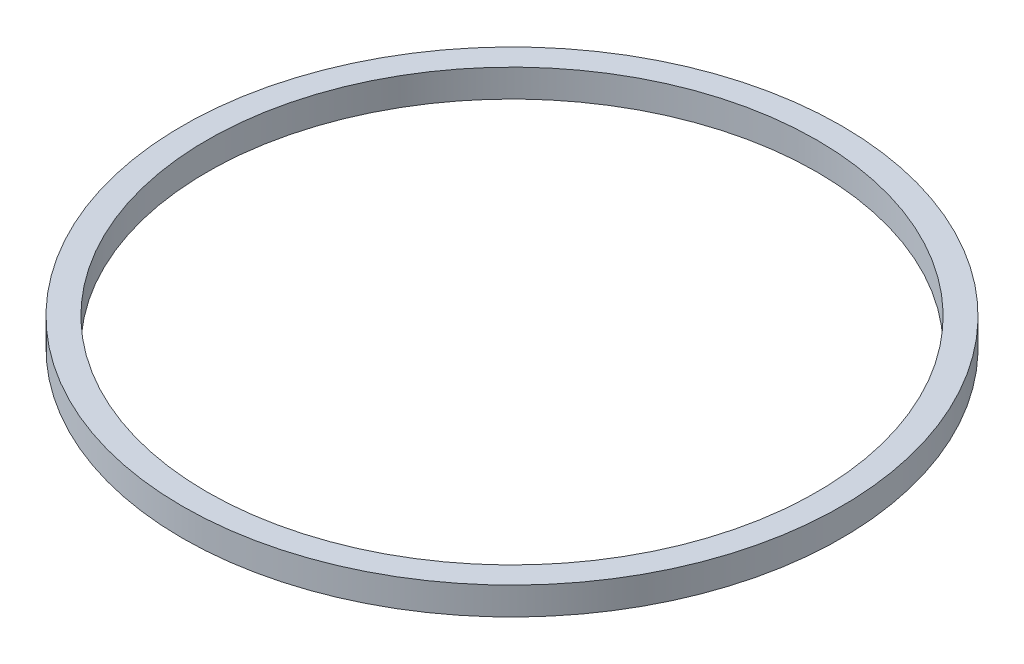
ISO-10303-21;
HEADER;
FILE_DESCRIPTION(('STEP AP214'),'2;1');
FILE_NAME('part.step','',(''),(''),'','','');
FILE_SCHEMA(('AUTOMOTIVE_DESIGN { 1 0 10303 214 1 1 1 1 }'));
ENDSEC;
DATA;
#1=APPLICATION_CONTEXT('core data for automotive mechanical design processes');
#2=APPLICATION_PROTOCOL_DEFINITION('international standard','automotive_design',2000,#1);
#3=PRODUCT_CONTEXT('',#1,'mechanical');
#4=PRODUCT('Part','Part','',(#3));
#5=PRODUCT_RELATED_PRODUCT_CATEGORY('part','',(#4));
#6=PRODUCT_DEFINITION_FORMATION('','',#4);
#7=PRODUCT_DEFINITION_CONTEXT('part definition',#1,'design');
#8=PRODUCT_DEFINITION('design','',#6,#7);
#9=PRODUCT_DEFINITION_SHAPE('','',#8);
#10=(LENGTH_UNIT() NAMED_UNIT(*) SI_UNIT(.MILLI.,.METRE.));
#11=(NAMED_UNIT(*) PLANE_ANGLE_UNIT() SI_UNIT($,.RADIAN.));
#12=(NAMED_UNIT(*) SI_UNIT($,.STERADIAN.) SOLID_ANGLE_UNIT());
#13=UNCERTAINTY_MEASURE_WITH_UNIT(LENGTH_MEASURE(1.E-05),#10,'distance_accuracy_value','');
#14=(GEOMETRIC_REPRESENTATION_CONTEXT(3) GLOBAL_UNCERTAINTY_ASSIGNED_CONTEXT((#13)) GLOBAL_UNIT_ASSIGNED_CONTEXT((#10,
#11,#12)) REPRESENTATION_CONTEXT('',''));
#15=CARTESIAN_POINT('',(0.,0.,0.));
#16=DIRECTION('',(0.,0.,1.));
#17=DIRECTION('',(1.,0.,0.));
#18=AXIS2_PLACEMENT_3D('',#15,#16,#17);
#19=CARTESIAN_POINT('',(0.,19.05,0.));
#20=DIRECTION('',(0.,1.,0.));
#21=DIRECTION('',(0.,0.,1.));
#22=AXIS2_PLACEMENT_3D('',#19,#20,#21);
#23=PLANE('',#22);
#24=CARTESIAN_POINT('',(0.,19.05,0.));
#25=DIRECTION('',(0.,1.,0.));
#26=DIRECTION('',(0.,0.,1.));
#27=AXIS2_PLACEMENT_3D('',#24,#25,#26);
#28=CIRCLE('',#27,227.);
#29=CARTESIAN_POINT('',(0.,19.05,-227.));
#30=VERTEX_POINT('',#29);
#31=EDGE_CURVE('E10',#30,#30,#28,.T.);
#32=ORIENTED_EDGE('',*,*,#31,.T.);
#33=EDGE_LOOP('',(#32));
#34=FACE_BOUND('',#33,.T.);
#35=CARTESIAN_POINT('',(0.,19.05,0.));
#36=DIRECTION('',(0.,1.,0.));
#37=DIRECTION('',(0.,0.,1.));
#38=AXIS2_PLACEMENT_3D('',#35,#36,#37);
#39=CIRCLE('',#38,210.);
#40=CARTESIAN_POINT('',(0.,19.05,-210.));
#41=VERTEX_POINT('',#40);
#42=EDGE_CURVE('E46',#41,#41,#39,.T.);
#43=ORIENTED_EDGE('',*,*,#42,.F.);
#44=EDGE_LOOP('',(#43));
#45=FACE_BOUND('',#44,.T.);
#46=ADVANCED_FACE('F35',(#34,#45),#23,.T.);
#47=CARTESIAN_POINT('',(0.,0.,0.));
#48=DIRECTION('',(0.,1.,0.));
#49=DIRECTION('',(0.,0.,1.));
#50=AXIS2_PLACEMENT_3D('',#47,#48,#49);
#51=PLANE('',#50);
#52=CARTESIAN_POINT('',(0.,0.,0.));
#53=DIRECTION('',(0.,1.,0.));
#54=DIRECTION('',(0.,0.,1.));
#55=AXIS2_PLACEMENT_3D('',#52,#53,#54);
#56=CIRCLE('',#55,227.);
#57=CARTESIAN_POINT('',(0.,0.,-227.));
#58=VERTEX_POINT('',#57);
#59=EDGE_CURVE('E39',#58,#58,#56,.T.);
#60=ORIENTED_EDGE('',*,*,#59,.F.);
#61=EDGE_LOOP('',(#60));
#62=FACE_BOUND('',#61,.T.);
#63=CARTESIAN_POINT('',(0.,0.,0.));
#64=DIRECTION('',(0.,1.,0.));
#65=DIRECTION('',(0.,0.,1.));
#66=AXIS2_PLACEMENT_3D('',#63,#64,#65);
#67=CIRCLE('',#66,210.);
#68=CARTESIAN_POINT('',(0.,0.,-210.));
#69=VERTEX_POINT('',#68);
#70=EDGE_CURVE('E48',#69,#69,#67,.T.);
#71=ORIENTED_EDGE('',*,*,#70,.T.);
#72=EDGE_LOOP('',(#71));
#73=FACE_BOUND('',#72,.T.);
#74=ADVANCED_FACE('F58',(#62,#73),#51,.F.);
#75=CARTESIAN_POINT('',(0.,19.05,0.));
#76=DIRECTION('',(0.,-1.,0.));
#77=DIRECTION('',(0.,0.,-1.));
#78=AXIS2_PLACEMENT_3D('',#75,#76,#77);
#79=CYLINDRICAL_SURFACE('',#78,227.);
#80=CARTESIAN_POINT('',(0.,19.05,-227.));
#81=CARTESIAN_POINT('',(0.,18.8515625,-227.));
#82=CARTESIAN_POINT('',(0.,18.653125,-227.));
#83=CARTESIAN_POINT('',(0.,18.25625,-227.));
#84=CARTESIAN_POINT('',(0.,18.0578125,-227.));
#85=CARTESIAN_POINT('',(0.,17.6609375,-227.));
#86=CARTESIAN_POINT('',(0.,17.4625,-227.));
#87=CARTESIAN_POINT('',(0.,17.065625,-227.));
#88=CARTESIAN_POINT('',(0.,16.8671875,-227.));
#89=CARTESIAN_POINT('',(0.,16.4703125,-227.));
#90=CARTESIAN_POINT('',(0.,16.271875,-227.));
#91=CARTESIAN_POINT('',(0.,15.875,-227.));
#92=CARTESIAN_POINT('',(0.,15.6765625,-227.));
#93=CARTESIAN_POINT('',(0.,15.2796875,-227.));
#94=CARTESIAN_POINT('',(0.,15.08125,-227.));
#95=CARTESIAN_POINT('',(0.,14.684375,-227.));
#96=CARTESIAN_POINT('',(0.,14.4859375,-227.));
#97=CARTESIAN_POINT('',(0.,14.0890625,-227.));
#98=CARTESIAN_POINT('',(0.,13.890625,-227.));
#99=CARTESIAN_POINT('',(0.,13.49375,-227.));
#100=CARTESIAN_POINT('',(0.,13.2953125,-227.));
#101=CARTESIAN_POINT('',(0.,12.8984375,-227.));
#102=CARTESIAN_POINT('',(0.,12.7,-227.));
#103=CARTESIAN_POINT('',(0.,12.303125,-227.));
#104=CARTESIAN_POINT('',(0.,12.1046875,-227.));
#105=CARTESIAN_POINT('',(0.,11.7078125,-227.));
#106=CARTESIAN_POINT('',(0.,11.509375,-227.));
#107=CARTESIAN_POINT('',(0.,11.1125,-227.));
#108=CARTESIAN_POINT('',(0.,10.9140625,-227.));
#109=CARTESIAN_POINT('',(0.,10.5171875,-227.));
#110=CARTESIAN_POINT('',(0.,10.31875,-227.));
#111=CARTESIAN_POINT('',(0.,9.921875,-227.));
#112=CARTESIAN_POINT('',(0.,9.7234375,-227.));
#113=CARTESIAN_POINT('',(0.,9.3265625,-227.));
#114=CARTESIAN_POINT('',(0.,9.128125,-227.));
#115=CARTESIAN_POINT('',(0.,8.73125,-227.));
#116=CARTESIAN_POINT('',(0.,8.5328125,-227.));
#117=CARTESIAN_POINT('',(0.,8.1359375,-227.));
#118=CARTESIAN_POINT('',(0.,7.9375,-227.));
#119=CARTESIAN_POINT('',(0.,7.540625,-227.));
#120=CARTESIAN_POINT('',(0.,7.3421875,-227.));
#121=CARTESIAN_POINT('',(0.,6.9453125,-227.));
#122=CARTESIAN_POINT('',(0.,6.746875,-227.));
#123=CARTESIAN_POINT('',(0.,6.35,-227.));
#124=CARTESIAN_POINT('',(0.,6.1515625,-227.));
#125=CARTESIAN_POINT('',(0.,5.7546875,-227.));
#126=CARTESIAN_POINT('',(0.,5.55625,-227.));
#127=CARTESIAN_POINT('',(0.,5.159375,-227.));
#128=CARTESIAN_POINT('',(0.,4.9609375,-227.));
#129=CARTESIAN_POINT('',(0.,4.5640625,-227.));
#130=CARTESIAN_POINT('',(0.,4.365625,-227.));
#131=CARTESIAN_POINT('',(0.,3.96875,-227.));
#132=CARTESIAN_POINT('',(0.,3.7703125,-227.));
#133=CARTESIAN_POINT('',(0.,3.3734375,-227.));
#134=CARTESIAN_POINT('',(0.,3.175,-227.));
#135=CARTESIAN_POINT('',(0.,2.778125,-227.));
#136=CARTESIAN_POINT('',(0.,2.5796875,-227.));
#137=CARTESIAN_POINT('',(0.,2.1828125,-227.));
#138=CARTESIAN_POINT('',(0.,1.984375,-227.));
#139=CARTESIAN_POINT('',(0.,1.5875,-227.));
#140=CARTESIAN_POINT('',(0.,1.3890625,-227.));
#141=CARTESIAN_POINT('',(0.,0.992187500000001,-227.));
#142=CARTESIAN_POINT('',(0.,0.793750000000001,-227.));
#143=CARTESIAN_POINT('',(0.,0.396875,-227.));
#144=CARTESIAN_POINT('',(0.,0.1984375,-227.));
#145=CARTESIAN_POINT('',(0.,0.,-227.));
#146=B_SPLINE_CURVE_WITH_KNOTS('',3,(#80,#81,#82,#83,#84,#85,#86,#87,#88,#89,#90,#91,#92,#93,
#94,#95,#96,#97,#98,#99,#100,#101,#102,#103,#104,#105,#106,#107,#108,#109,#110,#111,#112,#113,
#114,#115,#116,#117,#118,#119,#120,#121,#122,#123,#124,#125,#126,#127,#128,#129,#130,#131,#132,
#133,#134,#135,#136,#137,#138,#139,#140,#141,#142,#143,#144,#145),.UNSPECIFIED.,.F.,.F.,(4,2,2,
2,2,2,2,2,2,2,2,2,2,2,2,2,2,2,2,2,2,2,2,2,2,2,2,2,2,2,2,2,4),(0.,0.595312499999997,1.190625,
1.7859375,2.38125,2.9765625,3.571875,4.1671875,4.7625,5.3578125,5.953125,6.5484375,7.14375,
7.7390625,8.334375,8.9296875,9.525,10.1203125,10.715625,11.3109375,11.90625,12.5015625,
13.096875,13.6921875,14.2875,14.8828125,15.478125,16.0734375,16.66875,17.2640625,17.859375,
18.4546875,19.05),.UNSPECIFIED.);
#147=EDGE_CURVE('BSEAM37',#30,#58,#146,.T.);
#148=ORIENTED_EDGE('',*,*,#31,.F.);
#149=ORIENTED_EDGE('',*,*,#59,.T.);
#150=ORIENTED_EDGE('',*,*,#147,.T.);
#151=ORIENTED_EDGE('',*,*,#147,.F.);
#152=EDGE_LOOP('',(#148,#150,#149,#151));
#153=FACE_BOUND('',#152,.T.);
#154=ADVANCED_FACE('F37',(#153),#79,.T.);
#155=CARTESIAN_POINT('',(0.,19.05,0.));
#156=DIRECTION('',(0.,-1.,0.));
#157=DIRECTION('',(0.,0.,-1.));
#158=AXIS2_PLACEMENT_3D('',#155,#156,#157);
#159=CYLINDRICAL_SURFACE('',#158,210.);
#160=CARTESIAN_POINT('',(0.,19.05,-210.));
#161=CARTESIAN_POINT('',(0.,18.8515625,-210.));
#162=CARTESIAN_POINT('',(0.,18.653125,-210.));
#163=CARTESIAN_POINT('',(0.,18.25625,-210.));
#164=CARTESIAN_POINT('',(0.,18.0578125,-210.));
#165=CARTESIAN_POINT('',(0.,17.6609375,-210.));
#166=CARTESIAN_POINT('',(0.,17.4625,-210.));
#167=CARTESIAN_POINT('',(0.,17.065625,-210.));
#168=CARTESIAN_POINT('',(0.,16.8671875,-210.));
#169=CARTESIAN_POINT('',(0.,16.4703125,-210.));
#170=CARTESIAN_POINT('',(0.,16.271875,-210.));
#171=CARTESIAN_POINT('',(0.,15.875,-210.));
#172=CARTESIAN_POINT('',(0.,15.6765625,-210.));
#173=CARTESIAN_POINT('',(0.,15.2796875,-210.));
#174=CARTESIAN_POINT('',(0.,15.08125,-210.));
#175=CARTESIAN_POINT('',(0.,14.684375,-210.));
#176=CARTESIAN_POINT('',(0.,14.4859375,-210.));
#177=CARTESIAN_POINT('',(0.,14.0890625,-210.));
#178=CARTESIAN_POINT('',(0.,13.890625,-210.));
#179=CARTESIAN_POINT('',(0.,13.49375,-210.));
#180=CARTESIAN_POINT('',(0.,13.2953125,-210.));
#181=CARTESIAN_POINT('',(0.,12.8984375,-210.));
#182=CARTESIAN_POINT('',(0.,12.7,-210.));
#183=CARTESIAN_POINT('',(0.,12.303125,-210.));
#184=CARTESIAN_POINT('',(0.,12.1046875,-210.));
#185=CARTESIAN_POINT('',(0.,11.7078125,-210.));
#186=CARTESIAN_POINT('',(0.,11.509375,-210.));
#187=CARTESIAN_POINT('',(0.,11.1125,-210.));
#188=CARTESIAN_POINT('',(0.,10.9140625,-210.));
#189=CARTESIAN_POINT('',(0.,10.5171875,-210.));
#190=CARTESIAN_POINT('',(0.,10.31875,-210.));
#191=CARTESIAN_POINT('',(0.,9.921875,-210.));
#192=CARTESIAN_POINT('',(0.,9.7234375,-210.));
#193=CARTESIAN_POINT('',(0.,9.3265625,-210.));
#194=CARTESIAN_POINT('',(0.,9.128125,-210.));
#195=CARTESIAN_POINT('',(0.,8.73125,-210.));
#196=CARTESIAN_POINT('',(0.,8.5328125,-210.));
#197=CARTESIAN_POINT('',(0.,8.1359375,-210.));
#198=CARTESIAN_POINT('',(0.,7.9375,-210.));
#199=CARTESIAN_POINT('',(0.,7.540625,-210.));
#200=CARTESIAN_POINT('',(0.,7.3421875,-210.));
#201=CARTESIAN_POINT('',(0.,6.9453125,-210.));
#202=CARTESIAN_POINT('',(0.,6.746875,-210.));
#203=CARTESIAN_POINT('',(0.,6.35,-210.));
#204=CARTESIAN_POINT('',(0.,6.1515625,-210.));
#205=CARTESIAN_POINT('',(0.,5.7546875,-210.));
#206=CARTESIAN_POINT('',(0.,5.55625,-210.));
#207=CARTESIAN_POINT('',(0.,5.159375,-210.));
#208=CARTESIAN_POINT('',(0.,4.9609375,-210.));
#209=CARTESIAN_POINT('',(0.,4.5640625,-210.));
#210=CARTESIAN_POINT('',(0.,4.365625,-210.));
#211=CARTESIAN_POINT('',(0.,3.96875,-210.));
#212=CARTESIAN_POINT('',(0.,3.7703125,-210.));
#213=CARTESIAN_POINT('',(0.,3.3734375,-210.));
#214=CARTESIAN_POINT('',(0.,3.175,-210.));
#215=CARTESIAN_POINT('',(0.,2.778125,-210.));
#216=CARTESIAN_POINT('',(0.,2.5796875,-210.));
#217=CARTESIAN_POINT('',(0.,2.1828125,-210.));
#218=CARTESIAN_POINT('',(0.,1.984375,-210.));
#219=CARTESIAN_POINT('',(0.,1.5875,-210.));
#220=CARTESIAN_POINT('',(0.,1.3890625,-210.));
#221=CARTESIAN_POINT('',(0.,0.992187500000001,-210.));
#222=CARTESIAN_POINT('',(0.,0.793750000000001,-210.));
#223=CARTESIAN_POINT('',(0.,0.396875,-210.));
#224=CARTESIAN_POINT('',(0.,0.1984375,-210.));
#225=CARTESIAN_POINT('',(0.,0.,-210.));
#226=B_SPLINE_CURVE_WITH_KNOTS('',3,(#160,#161,#162,#163,#164,#165,#166,#167,#168,#169,#170,
#171,#172,#173,#174,#175,#176,#177,#178,#179,#180,#181,#182,#183,#184,#185,#186,#187,#188,#189,
#190,#191,#192,#193,#194,#195,#196,#197,#198,#199,#200,#201,#202,#203,#204,#205,#206,#207,#208,
#209,#210,#211,#212,#213,#214,#215,#216,#217,#218,#219,#220,#221,#222,#223,#224,#225),
.UNSPECIFIED.,.F.,.F.,(4,2,2,2,2,2,2,2,2,2,2,2,2,2,2,2,2,2,2,2,2,2,2,2,2,2,2,2,2,2,2,2,4),(0.,
0.595312499999997,1.190625,1.7859375,2.38125,2.9765625,3.571875,4.1671875,4.7625,5.3578125,
5.953125,6.5484375,7.14375,7.7390625,8.334375,8.9296875,9.525,10.1203125,10.715625,11.3109375,
11.90625,12.5015625,13.096875,13.6921875,14.2875,14.8828125,15.478125,16.0734375,16.66875,
17.2640625,17.859375,18.4546875,19.05),.UNSPECIFIED.);
#227=EDGE_CURVE('BSEAM54',#41,#69,#226,.T.);
#228=ORIENTED_EDGE('',*,*,#42,.T.);
#229=ORIENTED_EDGE('',*,*,#70,.F.);
#230=ORIENTED_EDGE('',*,*,#227,.T.);
#231=ORIENTED_EDGE('',*,*,#227,.F.);
#232=EDGE_LOOP('',(#228,#230,#229,#231));
#233=FACE_BOUND('',#232,.T.);
#234=ADVANCED_FACE('F54',(#233),#159,.F.);
#235=CLOSED_SHELL('',(#46,#74,#154,#234));
#236=MANIFOLD_SOLID_BREP('B2',#235);
#237=ADVANCED_BREP_SHAPE_REPRESENTATION('',(#18,#236),#14);
#238=SHAPE_DEFINITION_REPRESENTATION(#9,#237);
ENDSEC;
END-ISO-10303-21;
